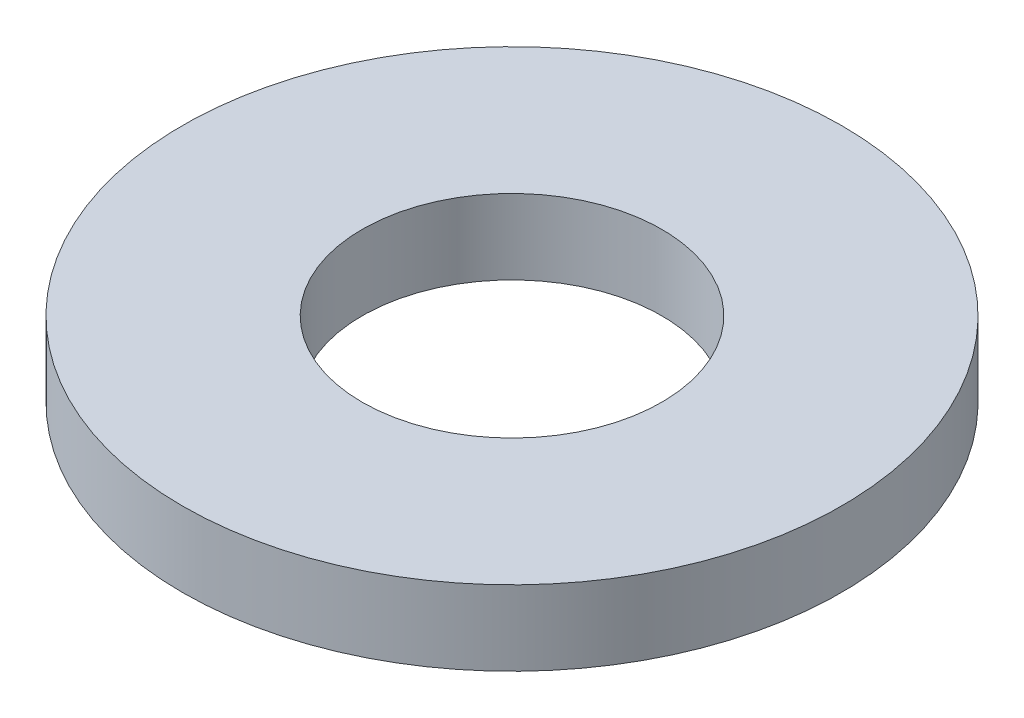
ISO-10303-21;
HEADER;
FILE_DESCRIPTION(('STEP AP214'),'2;1');
FILE_NAME('part.step','',(''),(''),'','','');
FILE_SCHEMA(('AUTOMOTIVE_DESIGN { 1 0 10303 214 1 1 1 1 }'));
ENDSEC;
DATA;
#1=APPLICATION_CONTEXT('core data for automotive mechanical design processes');
#2=APPLICATION_PROTOCOL_DEFINITION('international standard','automotive_design',2000,#1);
#3=PRODUCT_CONTEXT('',#1,'mechanical');
#4=PRODUCT('Part','Part','',(#3));
#5=PRODUCT_RELATED_PRODUCT_CATEGORY('part','',(#4));
#6=PRODUCT_DEFINITION_FORMATION('','',#4);
#7=PRODUCT_DEFINITION_CONTEXT('part definition',#1,'design');
#8=PRODUCT_DEFINITION('design','',#6,#7);
#9=PRODUCT_DEFINITION_SHAPE('','',#8);
#10=(LENGTH_UNIT() NAMED_UNIT(*) SI_UNIT(.MILLI.,.METRE.));
#11=(NAMED_UNIT(*) PLANE_ANGLE_UNIT() SI_UNIT($,.RADIAN.));
#12=(NAMED_UNIT(*) SI_UNIT($,.STERADIAN.) SOLID_ANGLE_UNIT());
#13=UNCERTAINTY_MEASURE_WITH_UNIT(LENGTH_MEASURE(1.E-05),#10,'distance_accuracy_value','');
#14=(GEOMETRIC_REPRESENTATION_CONTEXT(3) GLOBAL_UNCERTAINTY_ASSIGNED_CONTEXT((#13)) GLOBAL_UNIT_ASSIGNED_CONTEXT((#10,
#11,#12)) REPRESENTATION_CONTEXT('',''));
#15=CARTESIAN_POINT('',(0.,0.,0.));
#16=DIRECTION('',(0.,0.,1.));
#17=DIRECTION('',(1.,0.,0.));
#18=AXIS2_PLACEMENT_3D('',#15,#16,#17);
#19=CARTESIAN_POINT('',(0.,5.,0.));
#20=DIRECTION('',(0.,1.,0.));
#21=DIRECTION('',(0.,0.,1.));
#22=AXIS2_PLACEMENT_3D('',#19,#20,#21);
#23=PLANE('',#22);
#24=CARTESIAN_POINT('',(0.,5.,0.));
#25=DIRECTION('',(0.,1.,0.));
#26=DIRECTION('',(0.,0.,1.));
#27=AXIS2_PLACEMENT_3D('',#24,#25,#26);
#28=CIRCLE('',#27,22.);
#29=CARTESIAN_POINT('',(0.,5.,22.));
#30=VERTEX_POINT('',#29);
#31=EDGE_CURVE('E10',#30,#30,#28,.T.);
#32=ORIENTED_EDGE('',*,*,#31,.T.);
#33=EDGE_LOOP('',(#32));
#34=FACE_BOUND('',#33,.T.);
#35=CARTESIAN_POINT('',(0.,5.,0.));
#36=DIRECTION('',(0.,1.,0.));
#37=DIRECTION('',(0.,0.,1.));
#38=AXIS2_PLACEMENT_3D('',#35,#36,#37);
#39=CIRCLE('',#38,10.);
#40=CARTESIAN_POINT('',(0.,5.,10.));
#41=VERTEX_POINT('',#40);
#42=EDGE_CURVE('E41',#41,#41,#39,.T.);
#43=ORIENTED_EDGE('',*,*,#42,.F.);
#44=EDGE_LOOP('',(#43));
#45=FACE_BOUND('',#44,.T.);
#46=ADVANCED_FACE('F30',(#34,#45),#23,.T.);
#47=CARTESIAN_POINT('',(0.,0.,0.));
#48=DIRECTION('',(0.,1.,0.));
#49=DIRECTION('',(0.,0.,1.));
#50=AXIS2_PLACEMENT_3D('',#47,#48,#49);
#51=PLANE('',#50);
#52=CARTESIAN_POINT('',(0.,0.,0.));
#53=DIRECTION('',(0.,1.,0.));
#54=DIRECTION('',(0.,0.,1.));
#55=AXIS2_PLACEMENT_3D('',#52,#53,#54);
#56=CIRCLE('',#55,22.);
#57=CARTESIAN_POINT('',(0.,0.,22.));
#58=VERTEX_POINT('',#57);
#59=EDGE_CURVE('E34',#58,#58,#56,.T.);
#60=ORIENTED_EDGE('',*,*,#59,.F.);
#61=EDGE_LOOP('',(#60));
#62=FACE_BOUND('',#61,.T.);
#63=CARTESIAN_POINT('',(0.,0.,0.));
#64=DIRECTION('',(0.,1.,0.));
#65=DIRECTION('',(0.,0.,1.));
#66=AXIS2_PLACEMENT_3D('',#63,#64,#65);
#67=CIRCLE('',#66,10.);
#68=CARTESIAN_POINT('',(0.,0.,10.));
#69=VERTEX_POINT('',#68);
#70=EDGE_CURVE('E43',#69,#69,#67,.T.);
#71=ORIENTED_EDGE('',*,*,#70,.T.);
#72=EDGE_LOOP('',(#71));
#73=FACE_BOUND('',#72,.T.);
#74=ADVANCED_FACE('F53',(#62,#73),#51,.F.);
#75=CARTESIAN_POINT('',(0.,5.,0.));
#76=DIRECTION('',(0.,-1.,0.));
#77=DIRECTION('',(0.,0.,-1.));
#78=AXIS2_PLACEMENT_3D('',#75,#76,#77);
#79=CYLINDRICAL_SURFACE('',#78,22.);
#80=ORIENTED_EDGE('',*,*,#31,.F.);
#81=EDGE_LOOP('',(#80));
#82=FACE_BOUND('',#81,.T.);
#83=ORIENTED_EDGE('',*,*,#59,.T.);
#84=EDGE_LOOP('',(#83));
#85=FACE_BOUND('',#84,.T.);
#86=ADVANCED_FACE('F32',(#82,#85),#79,.T.);
#87=CARTESIAN_POINT('',(0.,5.,0.));
#88=DIRECTION('',(0.,-1.,0.));
#89=DIRECTION('',(0.,0.,-1.));
#90=AXIS2_PLACEMENT_3D('',#87,#88,#89);
#91=CYLINDRICAL_SURFACE('',#90,10.);
#92=ORIENTED_EDGE('',*,*,#42,.T.);
#93=EDGE_LOOP('',(#92));
#94=FACE_BOUND('',#93,.T.);
#95=ORIENTED_EDGE('',*,*,#70,.F.);
#96=EDGE_LOOP('',(#95));
#97=FACE_BOUND('',#96,.T.);
#98=ADVANCED_FACE('F49',(#94,#97),#91,.F.);
#99=CLOSED_SHELL('',(#46,#74,#86,#98));
#100=MANIFOLD_SOLID_BREP('B2',#99);
#101=ADVANCED_BREP_SHAPE_REPRESENTATION('',(#18,#100),#14);
#102=SHAPE_DEFINITION_REPRESENTATION(#9,#101);
ENDSEC;
END-ISO-10303-21;
